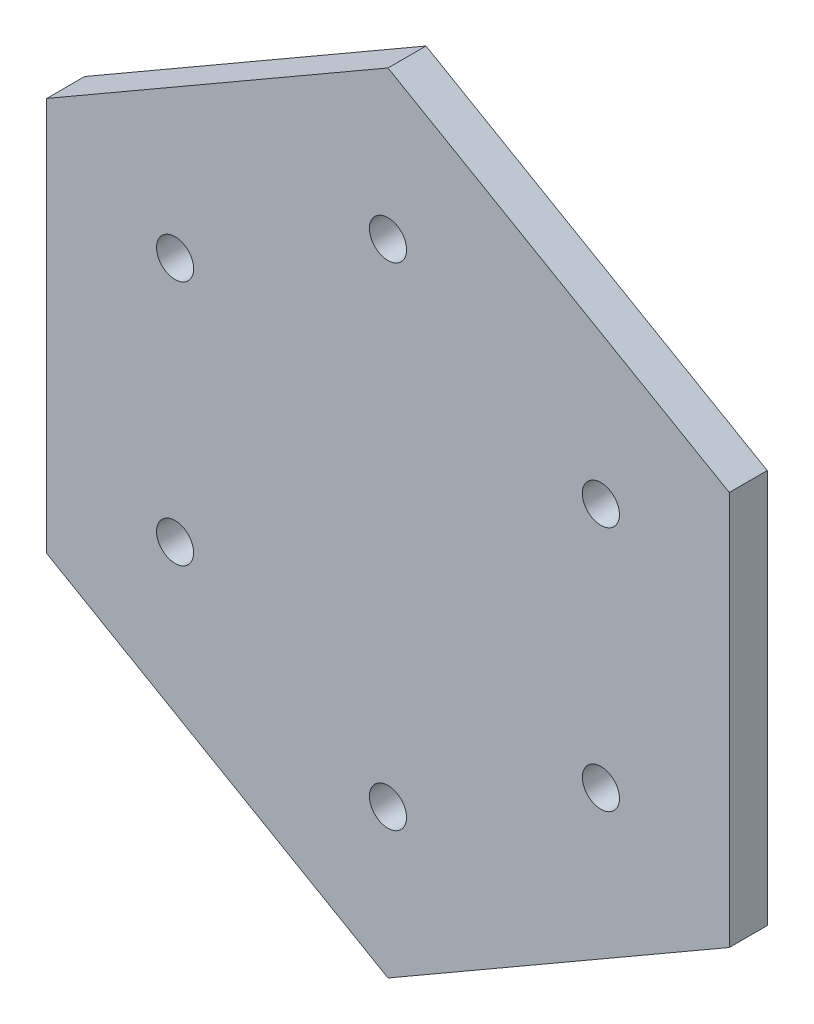
ISO-10303-21;
HEADER;
FILE_DESCRIPTION(('STEP AP214'),'2;1');
FILE_NAME('part.step','',(''),(''),'','','');
FILE_SCHEMA(('AUTOMOTIVE_DESIGN { 1 0 10303 214 1 1 1 1 }'));
ENDSEC;
DATA;
#1=APPLICATION_CONTEXT('core data for automotive mechanical design processes');
#2=APPLICATION_PROTOCOL_DEFINITION('international standard','automotive_design',2000,#1);
#3=PRODUCT_CONTEXT('',#1,'mechanical');
#4=PRODUCT('Part','Part','',(#3));
#5=PRODUCT_RELATED_PRODUCT_CATEGORY('part','',(#4));
#6=PRODUCT_DEFINITION_FORMATION('','',#4);
#7=PRODUCT_DEFINITION_CONTEXT('part definition',#1,'design');
#8=PRODUCT_DEFINITION('design','',#6,#7);
#9=PRODUCT_DEFINITION_SHAPE('','',#8);
#10=(LENGTH_UNIT() NAMED_UNIT(*) SI_UNIT(.MILLI.,.METRE.));
#11=(NAMED_UNIT(*) PLANE_ANGLE_UNIT() SI_UNIT($,.RADIAN.));
#12=(NAMED_UNIT(*) SI_UNIT($,.STERADIAN.) SOLID_ANGLE_UNIT());
#13=UNCERTAINTY_MEASURE_WITH_UNIT(LENGTH_MEASURE(1.E-05),#10,'distance_accuracy_value','');
#14=(GEOMETRIC_REPRESENTATION_CONTEXT(3) GLOBAL_UNCERTAINTY_ASSIGNED_CONTEXT((#13)) GLOBAL_UNIT_ASSIGNED_CONTEXT((#10,
#11,#12)) REPRESENTATION_CONTEXT('',''));
#15=CARTESIAN_POINT('',(0.,0.,0.));
#16=DIRECTION('',(0.,0.,1.));
#17=DIRECTION('',(1.,0.,0.));
#18=AXIS2_PLACEMENT_3D('',#15,#16,#17);
#19=CARTESIAN_POINT('',(0.,0.,3.175));
#20=DIRECTION('',(0.,0.,1.));
#21=DIRECTION('',(1.,0.,0.));
#22=AXIS2_PLACEMENT_3D('',#19,#20,#21);
#23=PLANE('',#22);
#24=CARTESIAN_POINT('',(0.,-20.53082,3.175));
#25=DIRECTION('',(0.,0.,1.));
#26=DIRECTION('',(1.,0.,0.));
#27=AXIS2_PLACEMENT_3D('',#24,#25,#26);
#28=CIRCLE('',#27,1.55);
#29=CARTESIAN_POINT('',(1.55,-20.53082,3.175));
#30=VERTEX_POINT('',#29);
#31=EDGE_CURVE('E226',#30,#30,#28,.T.);
#32=ORIENTED_EDGE('',*,*,#31,.F.);
#33=EDGE_LOOP('',(#32));
#34=FACE_BOUND('',#33,.T.);
#35=CARTESIAN_POINT('',(17.7802116805256,10.26541,3.175));
#36=DIRECTION('',(0.,0.,1.));
#37=DIRECTION('',(1.,0.,0.));
#38=AXIS2_PLACEMENT_3D('',#35,#36,#37);
#39=CIRCLE('',#38,1.55);
#40=CARTESIAN_POINT('',(19.3302116805256,10.26541,3.175));
#41=VERTEX_POINT('',#40);
#42=EDGE_CURVE('E242',#41,#41,#39,.T.);
#43=ORIENTED_EDGE('',*,*,#42,.F.);
#44=EDGE_LOOP('',(#43));
#45=FACE_BOUND('',#44,.T.);
#46=CARTESIAN_POINT('',(-17.7802116805256,10.26541,3.175));
#47=DIRECTION('',(0.,0.,1.));
#48=DIRECTION('',(1.,0.,0.));
#49=AXIS2_PLACEMENT_3D('',#46,#47,#48);
#50=CIRCLE('',#49,1.54999999999999);
#51=CARTESIAN_POINT('',(-16.2302116805256,10.26541,3.175));
#52=VERTEX_POINT('',#51);
#53=EDGE_CURVE('E140',#52,#52,#50,.T.);
#54=ORIENTED_EDGE('',*,*,#53,.F.);
#55=EDGE_LOOP('',(#54));
#56=FACE_BOUND('',#55,.T.);
#57=DIRECTION('',(0.,1.,0.));
#58=VECTOR('',#57,1.);
#59=CARTESIAN_POINT('',(28.5,-16.4544826719043,3.175));
#60=LINE('',#59,#58);
#61=CARTESIAN_POINT('',(28.5,-16.4544826719043,3.175));
#62=VERTEX_POINT('',#61);
#63=CARTESIAN_POINT('',(28.5,16.4544826719043,3.175));
#64=VERTEX_POINT('',#63);
#65=EDGE_CURVE('E152',#62,#64,#60,.T.);
#66=ORIENTED_EDGE('',*,*,#65,.T.);
#67=DIRECTION('',(-0.866025403784438,0.5,0.));
#68=VECTOR('',#67,1.);
#69=CARTESIAN_POINT('',(28.5,16.4544826719043,3.175));
#70=LINE('',#69,#68);
#71=CARTESIAN_POINT('',(0.,32.9089653438087,3.175));
#72=VERTEX_POINT('',#71);
#73=EDGE_CURVE('E100',#64,#72,#70,.T.);
#74=ORIENTED_EDGE('',*,*,#73,.T.);
#75=DIRECTION('',(-0.866025403784439,-0.5,0.));
#76=VECTOR('',#75,1.);
#77=CARTESIAN_POINT('',(0.,32.9089653438087,3.175));
#78=LINE('',#77,#76);
#79=CARTESIAN_POINT('',(-28.5,16.4544826719043,3.175));
#80=VERTEX_POINT('',#79);
#81=EDGE_CURVE('E113',#72,#80,#78,.T.);
#82=ORIENTED_EDGE('',*,*,#81,.T.);
#83=DIRECTION('',(0.,-1.,0.));
#84=VECTOR('',#83,1.);
#85=CARTESIAN_POINT('',(-28.5,16.4544826719043,3.175));
#86=LINE('',#85,#84);
#87=CARTESIAN_POINT('',(-28.5,-16.4544826719043,3.175));
#88=VERTEX_POINT('',#87);
#89=EDGE_CURVE('E107',#80,#88,#86,.T.);
#90=ORIENTED_EDGE('',*,*,#89,.T.);
#91=DIRECTION('',(0.866025403784438,-0.5,0.));
#92=VECTOR('',#91,1.);
#93=CARTESIAN_POINT('',(-28.5,-16.4544826719043,3.175));
#94=LINE('',#93,#92);
#95=CARTESIAN_POINT('',(0.,-32.9089653438087,3.175));
#96=VERTEX_POINT('',#95);
#97=EDGE_CURVE('E111',#88,#96,#94,.T.);
#98=ORIENTED_EDGE('',*,*,#97,.T.);
#99=DIRECTION('',(0.866025403784438,0.5,0.));
#100=VECTOR('',#99,1.);
#101=CARTESIAN_POINT('',(0.,-32.9089653438087,3.175));
#102=LINE('',#101,#100);
#103=EDGE_CURVE('E63',#96,#62,#102,.T.);
#104=ORIENTED_EDGE('',*,*,#103,.T.);
#105=EDGE_LOOP('',(#66,#74,#82,#90,#98,#104));
#106=FACE_BOUND('',#105,.T.);
#107=CARTESIAN_POINT('',(0.,20.53082,3.175));
#108=DIRECTION('',(0.,0.,1.));
#109=DIRECTION('',(1.,0.,0.));
#110=AXIS2_PLACEMENT_3D('',#107,#108,#109);
#111=CIRCLE('',#110,1.55);
#112=CARTESIAN_POINT('',(1.55,20.53082,3.175));
#113=VERTEX_POINT('',#112);
#114=EDGE_CURVE('E250',#113,#113,#111,.T.);
#115=ORIENTED_EDGE('',*,*,#114,.F.);
#116=EDGE_LOOP('',(#115));
#117=FACE_BOUND('',#116,.T.);
#118=CARTESIAN_POINT('',(17.7802116805256,-10.26541,3.175));
#119=DIRECTION('',(0.,0.,1.));
#120=DIRECTION('',(1.,0.,0.));
#121=AXIS2_PLACEMENT_3D('',#118,#119,#120);
#122=CIRCLE('',#121,1.55);
#123=CARTESIAN_POINT('',(19.3302116805256,-10.26541,3.175));
#124=VERTEX_POINT('',#123);
#125=EDGE_CURVE('E234',#124,#124,#122,.T.);
#126=ORIENTED_EDGE('',*,*,#125,.F.);
#127=EDGE_LOOP('',(#126));
#128=FACE_BOUND('',#127,.T.);
#129=CARTESIAN_POINT('',(-17.7802116805256,-10.26541,3.175));
#130=DIRECTION('',(0.,0.,1.));
#131=DIRECTION('',(1.,0.,0.));
#132=AXIS2_PLACEMENT_3D('',#129,#130,#131);
#133=CIRCLE('',#132,1.55);
#134=CARTESIAN_POINT('',(-16.2302116805256,-10.26541,3.175));
#135=VERTEX_POINT('',#134);
#136=EDGE_CURVE('E215',#135,#135,#133,.T.);
#137=ORIENTED_EDGE('',*,*,#136,.F.);
#138=EDGE_LOOP('',(#137));
#139=FACE_BOUND('',#138,.T.);
#140=ADVANCED_FACE('F45',(#34,#45,#56,#106,#117,#128,#139),#23,.T.);
#141=CARTESIAN_POINT('',(0.,0.,0.));
#142=DIRECTION('',(0.,0.,1.));
#143=DIRECTION('',(1.,0.,0.));
#144=AXIS2_PLACEMENT_3D('',#141,#142,#143);
#145=PLANE('',#144);
#146=DIRECTION('',(0.,1.,0.));
#147=VECTOR('',#146,1.);
#148=CARTESIAN_POINT('',(28.5,-16.4544826719043,0.));
#149=LINE('',#148,#147);
#150=CARTESIAN_POINT('',(28.5,-16.4544826719043,0.));
#151=VERTEX_POINT('',#150);
#152=CARTESIAN_POINT('',(28.5,16.4544826719043,0.));
#153=VERTEX_POINT('',#152);
#154=EDGE_CURVE('E135',#151,#153,#149,.T.);
#155=ORIENTED_EDGE('',*,*,#154,.F.);
#156=DIRECTION('',(0.866025403784438,0.5,0.));
#157=VECTOR('',#156,1.);
#158=CARTESIAN_POINT('',(0.,-32.9089653438087,0.));
#159=LINE('',#158,#157);
#160=CARTESIAN_POINT('',(0.,-32.9089653438087,0.));
#161=VERTEX_POINT('',#160);
#162=EDGE_CURVE('E92',#161,#151,#159,.T.);
#163=ORIENTED_EDGE('',*,*,#162,.F.);
#164=DIRECTION('',(0.866025403784438,-0.5,0.));
#165=VECTOR('',#164,1.);
#166=CARTESIAN_POINT('',(-28.5,-16.4544826719043,0.));
#167=LINE('',#166,#165);
#168=CARTESIAN_POINT('',(-28.5,-16.4544826719043,0.));
#169=VERTEX_POINT('',#168);
#170=EDGE_CURVE('E86',#169,#161,#167,.T.);
#171=ORIENTED_EDGE('',*,*,#170,.F.);
#172=DIRECTION('',(0.,-1.,0.));
#173=VECTOR('',#172,1.);
#174=CARTESIAN_POINT('',(-28.5,16.4544826719043,0.));
#175=LINE('',#174,#173);
#176=CARTESIAN_POINT('',(-28.5,16.4544826719043,0.));
#177=VERTEX_POINT('',#176);
#178=EDGE_CURVE('E122',#177,#169,#175,.T.);
#179=ORIENTED_EDGE('',*,*,#178,.F.);
#180=DIRECTION('',(-0.866025403784439,-0.5,0.));
#181=VECTOR('',#180,1.);
#182=CARTESIAN_POINT('',(0.,32.9089653438087,0.));
#183=LINE('',#182,#181);
#184=CARTESIAN_POINT('',(0.,32.9089653438087,0.));
#185=VERTEX_POINT('',#184);
#186=EDGE_CURVE('E143',#185,#177,#183,.T.);
#187=ORIENTED_EDGE('',*,*,#186,.F.);
#188=DIRECTION('',(-0.866025403784438,0.5,0.));
#189=VECTOR('',#188,1.);
#190=CARTESIAN_POINT('',(28.5,16.4544826719043,0.));
#191=LINE('',#190,#189);
#192=EDGE_CURVE('E139',#153,#185,#191,.T.);
#193=ORIENTED_EDGE('',*,*,#192,.F.);
#194=EDGE_LOOP('',(#155,#163,#171,#179,#187,#193));
#195=FACE_BOUND('',#194,.T.);
#196=CARTESIAN_POINT('',(-17.7802116805256,10.26541,0.));
#197=DIRECTION('',(0.,0.,1.));
#198=DIRECTION('',(1.,0.,0.));
#199=AXIS2_PLACEMENT_3D('',#196,#197,#198);
#200=CIRCLE('',#199,1.54999999999999);
#201=CARTESIAN_POINT('',(-16.2302116805256,10.26541,0.));
#202=VERTEX_POINT('',#201);
#203=EDGE_CURVE('E254',#202,#202,#200,.T.);
#204=ORIENTED_EDGE('',*,*,#203,.T.);
#205=EDGE_LOOP('',(#204));
#206=FACE_BOUND('',#205,.T.);
#207=CARTESIAN_POINT('',(0.,20.53082,0.));
#208=DIRECTION('',(0.,0.,1.));
#209=DIRECTION('',(1.,0.,0.));
#210=AXIS2_PLACEMENT_3D('',#207,#208,#209);
#211=CIRCLE('',#210,1.55);
#212=CARTESIAN_POINT('',(1.55,20.53082,0.));
#213=VERTEX_POINT('',#212);
#214=EDGE_CURVE('E246',#213,#213,#211,.T.);
#215=ORIENTED_EDGE('',*,*,#214,.T.);
#216=EDGE_LOOP('',(#215));
#217=FACE_BOUND('',#216,.T.);
#218=CARTESIAN_POINT('',(17.7802116805256,10.26541,0.));
#219=DIRECTION('',(0.,0.,1.));
#220=DIRECTION('',(1.,0.,0.));
#221=AXIS2_PLACEMENT_3D('',#218,#219,#220);
#222=CIRCLE('',#221,1.55);
#223=CARTESIAN_POINT('',(19.3302116805256,10.26541,0.));
#224=VERTEX_POINT('',#223);
#225=EDGE_CURVE('E238',#224,#224,#222,.T.);
#226=ORIENTED_EDGE('',*,*,#225,.T.);
#227=EDGE_LOOP('',(#226));
#228=FACE_BOUND('',#227,.T.);
#229=CARTESIAN_POINT('',(17.7802116805256,-10.26541,0.));
#230=DIRECTION('',(0.,0.,1.));
#231=DIRECTION('',(1.,0.,0.));
#232=AXIS2_PLACEMENT_3D('',#229,#230,#231);
#233=CIRCLE('',#232,1.55);
#234=CARTESIAN_POINT('',(19.3302116805256,-10.26541,0.));
#235=VERTEX_POINT('',#234);
#236=EDGE_CURVE('E230',#235,#235,#233,.T.);
#237=ORIENTED_EDGE('',*,*,#236,.T.);
#238=EDGE_LOOP('',(#237));
#239=FACE_BOUND('',#238,.T.);
#240=CARTESIAN_POINT('',(0.,-20.53082,0.));
#241=DIRECTION('',(0.,0.,1.));
#242=DIRECTION('',(1.,0.,0.));
#243=AXIS2_PLACEMENT_3D('',#240,#241,#242);
#244=CIRCLE('',#243,1.55);
#245=CARTESIAN_POINT('',(1.55,-20.53082,0.));
#246=VERTEX_POINT('',#245);
#247=EDGE_CURVE('E223',#246,#246,#244,.T.);
#248=ORIENTED_EDGE('',*,*,#247,.T.);
#249=EDGE_LOOP('',(#248));
#250=FACE_BOUND('',#249,.T.);
#251=CARTESIAN_POINT('',(-17.7802116805256,-10.26541,0.));
#252=DIRECTION('',(0.,0.,1.));
#253=DIRECTION('',(1.,0.,0.));
#254=AXIS2_PLACEMENT_3D('',#251,#252,#253);
#255=CIRCLE('',#254,1.55);
#256=CARTESIAN_POINT('',(-16.2302116805256,-10.26541,0.));
#257=VERTEX_POINT('',#256);
#258=EDGE_CURVE('E218',#257,#257,#255,.T.);
#259=ORIENTED_EDGE('',*,*,#258,.T.);
#260=EDGE_LOOP('',(#259));
#261=FACE_BOUND('',#260,.T.);
#262=ADVANCED_FACE('F165',(#195,#206,#217,#228,#239,#250,#261),#145,.F.);
#263=CARTESIAN_POINT('',(28.5,-16.4544826719043,3.175));
#264=DIRECTION('',(-1.,0.,0.));
#265=DIRECTION('',(0.,-1.,0.));
#266=AXIS2_PLACEMENT_3D('',#263,#264,#265);
#267=PLANE('',#266);
#268=ORIENTED_EDGE('',*,*,#154,.T.);
#269=DIRECTION('',(0.,0.,-1.));
#270=VECTOR('',#269,1.);
#271=CARTESIAN_POINT('',(28.5,16.4544826719043,3.175));
#272=LINE('',#271,#270);
#273=EDGE_CURVE('E11',#64,#153,#272,.T.);
#274=ORIENTED_EDGE('',*,*,#273,.F.);
#275=ORIENTED_EDGE('',*,*,#65,.F.);
#276=DIRECTION('',(0.,0.,-1.));
#277=VECTOR('',#276,1.);
#278=CARTESIAN_POINT('',(28.5,-16.4544826719043,3.175));
#279=LINE('',#278,#277);
#280=EDGE_CURVE('E131',#62,#151,#279,.T.);
#281=ORIENTED_EDGE('',*,*,#280,.T.);
#282=EDGE_LOOP('',(#268,#274,#275,#281));
#283=FACE_BOUND('',#282,.T.);
#284=ADVANCED_FACE('F47',(#283),#267,.F.);
#285=CARTESIAN_POINT('',(28.5,16.4544826719043,3.175));
#286=DIRECTION('',(-0.5,-0.866025403784438,0.));
#287=DIRECTION('',(0.866025403784439,-0.5,0.));
#288=AXIS2_PLACEMENT_3D('',#285,#286,#287);
#289=PLANE('',#288);
#290=ORIENTED_EDGE('',*,*,#192,.T.);
#291=DIRECTION('',(0.,0.,-1.));
#292=VECTOR('',#291,1.);
#293=CARTESIAN_POINT('',(0.,32.9089653438087,3.175));
#294=LINE('',#293,#292);
#295=EDGE_CURVE('E55',#72,#185,#294,.T.);
#296=ORIENTED_EDGE('',*,*,#295,.F.);
#297=ORIENTED_EDGE('',*,*,#73,.F.);
#298=ORIENTED_EDGE('',*,*,#273,.T.);
#299=EDGE_LOOP('',(#290,#296,#297,#298));
#300=FACE_BOUND('',#299,.T.);
#301=ADVANCED_FACE('F342',(#300),#289,.F.);
#302=CARTESIAN_POINT('',(0.,32.9089653438087,3.175));
#303=DIRECTION('',(0.5,-0.866025403784438,0.));
#304=DIRECTION('',(0.866025403784439,0.5,0.));
#305=AXIS2_PLACEMENT_3D('',#302,#303,#304);
#306=PLANE('',#305);
#307=ORIENTED_EDGE('',*,*,#186,.T.);
#308=DIRECTION('',(0.,0.,-1.));
#309=VECTOR('',#308,1.);
#310=CARTESIAN_POINT('',(-28.5,16.4544826719043,3.175));
#311=LINE('',#310,#309);
#312=EDGE_CURVE('E124',#80,#177,#311,.T.);
#313=ORIENTED_EDGE('',*,*,#312,.F.);
#314=ORIENTED_EDGE('',*,*,#81,.F.);
#315=ORIENTED_EDGE('',*,*,#295,.T.);
#316=EDGE_LOOP('',(#307,#313,#314,#315));
#317=FACE_BOUND('',#316,.T.);
#318=ADVANCED_FACE('F162',(#317),#306,.F.);
#319=CARTESIAN_POINT('',(-28.5,16.4544826719043,3.175));
#320=DIRECTION('',(1.,0.,0.));
#321=DIRECTION('',(0.,1.,0.));
#322=AXIS2_PLACEMENT_3D('',#319,#320,#321);
#323=PLANE('',#322);
#324=ORIENTED_EDGE('',*,*,#178,.T.);
#325=DIRECTION('',(0.,0.,-1.));
#326=VECTOR('',#325,1.);
#327=CARTESIAN_POINT('',(-28.5,-16.4544826719043,3.175));
#328=LINE('',#327,#326);
#329=EDGE_CURVE('E119',#88,#169,#328,.T.);
#330=ORIENTED_EDGE('',*,*,#329,.F.);
#331=ORIENTED_EDGE('',*,*,#89,.F.);
#332=ORIENTED_EDGE('',*,*,#312,.T.);
#333=EDGE_LOOP('',(#324,#330,#331,#332));
#334=FACE_BOUND('',#333,.T.);
#335=ADVANCED_FACE('F120',(#334),#323,.F.);
#336=CARTESIAN_POINT('',(-28.5,-16.4544826719043,3.175));
#337=DIRECTION('',(0.5,0.866025403784438,0.));
#338=DIRECTION('',(-0.866025403784439,0.5,0.));
#339=AXIS2_PLACEMENT_3D('',#336,#337,#338);
#340=PLANE('',#339);
#341=ORIENTED_EDGE('',*,*,#170,.T.);
#342=DIRECTION('',(0.,0.,-1.));
#343=VECTOR('',#342,1.);
#344=CARTESIAN_POINT('',(0.,-32.9089653438087,3.175));
#345=LINE('',#344,#343);
#346=EDGE_CURVE('E125',#96,#161,#345,.T.);
#347=ORIENTED_EDGE('',*,*,#346,.F.);
#348=ORIENTED_EDGE('',*,*,#97,.F.);
#349=ORIENTED_EDGE('',*,*,#329,.T.);
#350=EDGE_LOOP('',(#341,#347,#348,#349));
#351=FACE_BOUND('',#350,.T.);
#352=ADVANCED_FACE('F127',(#351),#340,.F.);
#353=CARTESIAN_POINT('',(0.,-32.9089653438087,3.175));
#354=DIRECTION('',(-0.5,0.866025403784438,0.));
#355=DIRECTION('',(-0.866025403784439,-0.5,0.));
#356=AXIS2_PLACEMENT_3D('',#353,#354,#355);
#357=PLANE('',#356);
#358=ORIENTED_EDGE('',*,*,#162,.T.);
#359=ORIENTED_EDGE('',*,*,#280,.F.);
#360=ORIENTED_EDGE('',*,*,#103,.F.);
#361=ORIENTED_EDGE('',*,*,#346,.T.);
#362=EDGE_LOOP('',(#358,#359,#360,#361));
#363=FACE_BOUND('',#362,.T.);
#364=ADVANCED_FACE('F170',(#363),#357,.F.);
#365=CARTESIAN_POINT('',(-17.7802116805256,10.26541,3.175));
#366=DIRECTION('',(0.,0.,-1.));
#367=DIRECTION('',(-1.,0.,0.));
#368=AXIS2_PLACEMENT_3D('',#365,#366,#367);
#369=CYLINDRICAL_SURFACE('',#368,1.54999999999999);
#370=ORIENTED_EDGE('',*,*,#53,.T.);
#371=EDGE_LOOP('',(#370));
#372=FACE_BOUND('',#371,.T.);
#373=ORIENTED_EDGE('',*,*,#203,.F.);
#374=EDGE_LOOP('',(#373));
#375=FACE_BOUND('',#374,.T.);
#376=ADVANCED_FACE('F172',(#372,#375),#369,.F.);
#377=CARTESIAN_POINT('',(0.,20.53082,3.175));
#378=DIRECTION('',(0.,0.,-1.));
#379=DIRECTION('',(-1.,0.,0.));
#380=AXIS2_PLACEMENT_3D('',#377,#378,#379);
#381=CYLINDRICAL_SURFACE('',#380,1.55);
#382=ORIENTED_EDGE('',*,*,#114,.T.);
#383=EDGE_LOOP('',(#382));
#384=FACE_BOUND('',#383,.T.);
#385=ORIENTED_EDGE('',*,*,#214,.F.);
#386=EDGE_LOOP('',(#385));
#387=FACE_BOUND('',#386,.T.);
#388=ADVANCED_FACE('F178',(#384,#387),#381,.F.);
#389=CARTESIAN_POINT('',(17.7802116805256,10.26541,3.175));
#390=DIRECTION('',(0.,0.,-1.));
#391=DIRECTION('',(-1.,0.,0.));
#392=AXIS2_PLACEMENT_3D('',#389,#390,#391);
#393=CYLINDRICAL_SURFACE('',#392,1.55);
#394=ORIENTED_EDGE('',*,*,#42,.T.);
#395=EDGE_LOOP('',(#394));
#396=FACE_BOUND('',#395,.T.);
#397=ORIENTED_EDGE('',*,*,#225,.F.);
#398=EDGE_LOOP('',(#397));
#399=FACE_BOUND('',#398,.T.);
#400=ADVANCED_FACE('F194',(#396,#399),#393,.F.);
#401=CARTESIAN_POINT('',(17.7802116805256,-10.26541,3.175));
#402=DIRECTION('',(0.,0.,-1.));
#403=DIRECTION('',(-1.,0.,0.));
#404=AXIS2_PLACEMENT_3D('',#401,#402,#403);
#405=CYLINDRICAL_SURFACE('',#404,1.55);
#406=ORIENTED_EDGE('',*,*,#125,.T.);
#407=EDGE_LOOP('',(#406));
#408=FACE_BOUND('',#407,.T.);
#409=ORIENTED_EDGE('',*,*,#236,.F.);
#410=EDGE_LOOP('',(#409));
#411=FACE_BOUND('',#410,.T.);
#412=ADVANCED_FACE('F198',(#408,#411),#405,.F.);
#413=CARTESIAN_POINT('',(0.,-20.53082,3.175));
#414=DIRECTION('',(0.,0.,-1.));
#415=DIRECTION('',(-1.,0.,0.));
#416=AXIS2_PLACEMENT_3D('',#413,#414,#415);
#417=CYLINDRICAL_SURFACE('',#416,1.55);
#418=ORIENTED_EDGE('',*,*,#31,.T.);
#419=EDGE_LOOP('',(#418));
#420=FACE_BOUND('',#419,.T.);
#421=ORIENTED_EDGE('',*,*,#247,.F.);
#422=EDGE_LOOP('',(#421));
#423=FACE_BOUND('',#422,.T.);
#424=ADVANCED_FACE('F202',(#420,#423),#417,.F.);
#425=CARTESIAN_POINT('',(-17.7802116805256,-10.26541,3.175));
#426=DIRECTION('',(0.,0.,-1.));
#427=DIRECTION('',(-1.,0.,0.));
#428=AXIS2_PLACEMENT_3D('',#425,#426,#427);
#429=CYLINDRICAL_SURFACE('',#428,1.55);
#430=ORIENTED_EDGE('',*,*,#136,.T.);
#431=EDGE_LOOP('',(#430));
#432=FACE_BOUND('',#431,.T.);
#433=ORIENTED_EDGE('',*,*,#258,.F.);
#434=EDGE_LOOP('',(#433));
#435=FACE_BOUND('',#434,.T.);
#436=ADVANCED_FACE('F206',(#432,#435),#429,.F.);
#437=CLOSED_SHELL('',(#140,#262,#284,#301,#318,#335,#352,#364,#376,#388,#400,#412,#424,#436));
#438=MANIFOLD_SOLID_BREP('B2',#437);
#439=ADVANCED_BREP_SHAPE_REPRESENTATION('',(#18,#438),#14);
#440=SHAPE_DEFINITION_REPRESENTATION(#9,#439);
ENDSEC;
END-ISO-10303-21;
